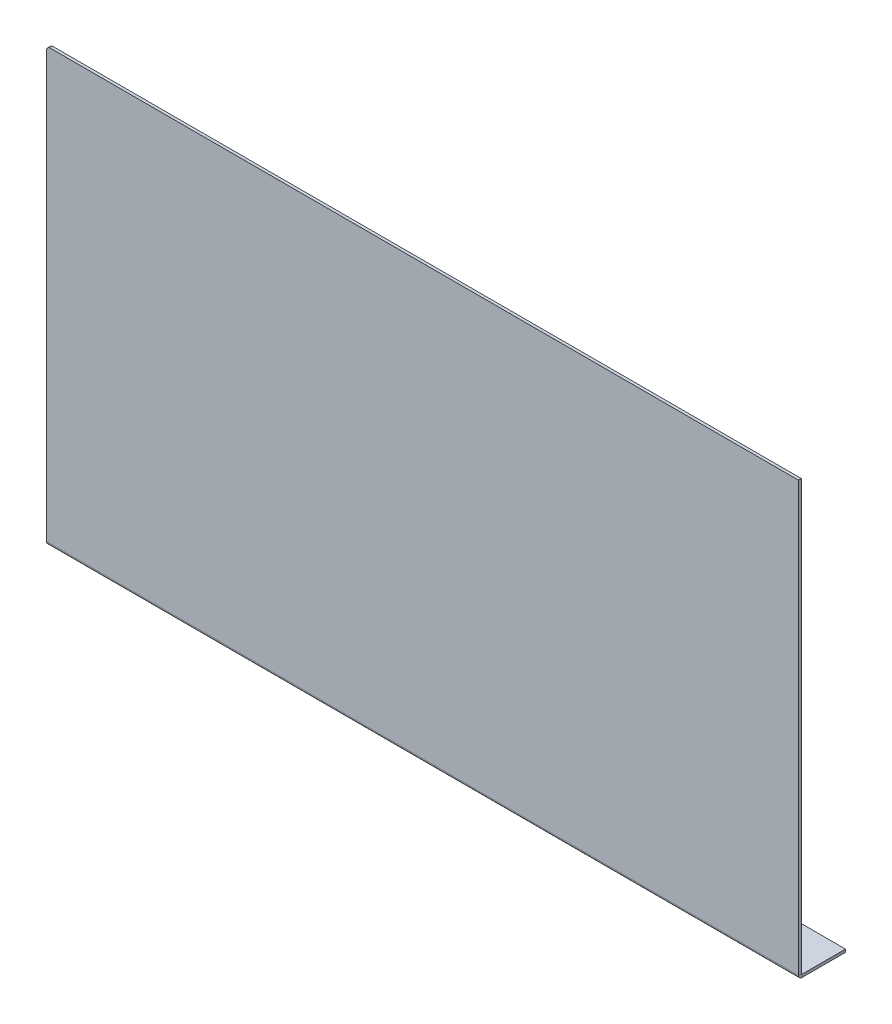
ISO-10303-21;
HEADER;
FILE_DESCRIPTION(('STEP AP214'),'2;1');
FILE_NAME('part.step','',(''),(''),'','','');
FILE_SCHEMA(('AUTOMOTIVE_DESIGN { 1 0 10303 214 1 1 1 1 }'));
ENDSEC;
DATA;
#1=APPLICATION_CONTEXT('core data for automotive mechanical design processes');
#2=APPLICATION_PROTOCOL_DEFINITION('international standard','automotive_design',2000,#1);
#3=PRODUCT_CONTEXT('',#1,'mechanical');
#4=PRODUCT('Part','Part','',(#3));
#5=PRODUCT_RELATED_PRODUCT_CATEGORY('part','',(#4));
#6=PRODUCT_DEFINITION_FORMATION('','',#4);
#7=PRODUCT_DEFINITION_CONTEXT('part definition',#1,'design');
#8=PRODUCT_DEFINITION('design','',#6,#7);
#9=PRODUCT_DEFINITION_SHAPE('','',#8);
#10=(LENGTH_UNIT() NAMED_UNIT(*) SI_UNIT(.MILLI.,.METRE.));
#11=(NAMED_UNIT(*) PLANE_ANGLE_UNIT() SI_UNIT($,.RADIAN.));
#12=(NAMED_UNIT(*) SI_UNIT($,.STERADIAN.) SOLID_ANGLE_UNIT());
#13=UNCERTAINTY_MEASURE_WITH_UNIT(LENGTH_MEASURE(1.E-05),#10,'distance_accuracy_value','');
#14=(GEOMETRIC_REPRESENTATION_CONTEXT(3) GLOBAL_UNCERTAINTY_ASSIGNED_CONTEXT((#13)) GLOBAL_UNIT_ASSIGNED_CONTEXT((#10,
#11,#12)) REPRESENTATION_CONTEXT('',''));
#15=CARTESIAN_POINT('',(0.,0.,0.));
#16=DIRECTION('',(0.,0.,1.));
#17=DIRECTION('',(1.,0.,0.));
#18=AXIS2_PLACEMENT_3D('',#15,#16,#17);
#19=CARTESIAN_POINT('',(176.5,-124.5,-25.));
#20=DIRECTION('',(-1.,0.,0.));
#21=DIRECTION('',(0.,0.,1.));
#22=AXIS2_PLACEMENT_3D('',#19,#20,#21);
#23=PLANE('',#22);
#24=DIRECTION('',(0.,0.,-1.));
#25=VECTOR('',#24,1.);
#26=CARTESIAN_POINT('',(176.5,-122.171572875254,-23.5));
#27=LINE('',#26,#25);
#28=CARTESIAN_POINT('',(176.5,-122.171572875254,-23.5));
#29=VERTEX_POINT('',#28);
#30=CARTESIAN_POINT('',(176.5,-122.171572875254,-25.));
#31=VERTEX_POINT('',#30);
#32=EDGE_CURVE('E316',#29,#31,#27,.T.);
#33=ORIENTED_EDGE('',*,*,#32,.T.);
#34=DIRECTION('',(0.,-1.,0.));
#35=VECTOR('',#34,1.);
#36=CARTESIAN_POINT('',(176.5,0.,-25.));
#37=LINE('',#36,#35);
#38=CARTESIAN_POINT('',(176.5,-115.5,-25.));
#39=VERTEX_POINT('',#38);
#40=EDGE_CURVE('E334',#39,#31,#37,.T.);
#41=ORIENTED_EDGE('',*,*,#40,.F.);
#42=DIRECTION('',(0.,0.,1.));
#43=VECTOR('',#42,1.);
#44=CARTESIAN_POINT('',(176.5,-115.5,-23.5));
#45=LINE('',#44,#43);
#46=CARTESIAN_POINT('',(176.5,-115.5,-23.5));
#47=VERTEX_POINT('',#46);
#48=EDGE_CURVE('E343',#47,#39,#45,.F.);
#49=ORIENTED_EDGE('',*,*,#48,.F.);
#50=DIRECTION('',(0.,1.,0.));
#51=VECTOR('',#50,1.);
#52=CARTESIAN_POINT('',(176.5,-124.5,-23.5));
#53=LINE('',#52,#51);
#54=EDGE_CURVE('E338',#47,#29,#53,.F.);
#55=ORIENTED_EDGE('',*,*,#54,.T.);
#56=EDGE_LOOP('',(#33,#41,#49,#55));
#57=FACE_BOUND('',#56,.T.);
#58=ADVANCED_FACE('F98',(#57),#23,.F.);
#59=CARTESIAN_POINT('',(-176.5,-115.,-25.));
#60=DIRECTION('',(1.,0.,0.));
#61=DIRECTION('',(0.,1.,0.));
#62=AXIS2_PLACEMENT_3D('',#59,#60,#61);
#63=PLANE('',#62);
#64=DIRECTION('',(0.,0.,-1.));
#65=VECTOR('',#64,1.);
#66=CARTESIAN_POINT('',(-176.5,-122.171572875254,-23.5));
#67=LINE('',#66,#65);
#68=CARTESIAN_POINT('',(-176.5,-122.171572875254,-23.5));
#69=VERTEX_POINT('',#68);
#70=CARTESIAN_POINT('',(-176.5,-122.171572875254,-25.));
#71=VERTEX_POINT('',#70);
#72=EDGE_CURVE('E325',#69,#71,#67,.T.);
#73=ORIENTED_EDGE('',*,*,#72,.F.);
#74=DIRECTION('',(0.,-1.,0.));
#75=VECTOR('',#74,1.);
#76=CARTESIAN_POINT('',(-176.5,-115.,-23.5));
#77=LINE('',#76,#75);
#78=CARTESIAN_POINT('',(-176.5,-115.5,-23.5));
#79=VERTEX_POINT('',#78);
#80=EDGE_CURVE('E336',#69,#79,#77,.F.);
#81=ORIENTED_EDGE('',*,*,#80,.T.);
#82=DIRECTION('',(0.,0.,1.));
#83=VECTOR('',#82,1.);
#84=CARTESIAN_POINT('',(-176.5,-115.5,-25.));
#85=LINE('',#84,#83);
#86=CARTESIAN_POINT('',(-176.5,-115.5,-25.));
#87=VERTEX_POINT('',#86);
#88=EDGE_CURVE('E328',#79,#87,#85,.F.);
#89=ORIENTED_EDGE('',*,*,#88,.T.);
#90=DIRECTION('',(0.,1.,0.));
#91=VECTOR('',#90,1.);
#92=CARTESIAN_POINT('',(-176.5,5.2090660055126E-13,-25.));
#93=LINE('',#92,#91);
#94=EDGE_CURVE('E331',#71,#87,#93,.T.);
#95=ORIENTED_EDGE('',*,*,#94,.F.);
#96=EDGE_LOOP('',(#73,#81,#89,#95));
#97=FACE_BOUND('',#96,.T.);
#98=ADVANCED_FACE('F560',(#97),#63,.F.);
#99=CARTESIAN_POINT('',(0.,0.,-25.));
#100=DIRECTION('',(0.,0.,1.));
#101=DIRECTION('',(1.,0.,0.));
#102=AXIS2_PLACEMENT_3D('',#99,#100,#101);
#103=PLANE('',#102);
#104=DIRECTION('',(1.,0.,0.));
#105=VECTOR('',#104,1.);
#106=CARTESIAN_POINT('',(176.5,-122.171572875254,-25.));
#107=LINE('',#106,#105);
#108=EDGE_CURVE('E310',#31,#71,#107,.F.);
#109=ORIENTED_EDGE('',*,*,#108,.T.);
#110=ORIENTED_EDGE('',*,*,#94,.T.);
#111=DIRECTION('',(1.,0.,0.));
#112=VECTOR('',#111,1.);
#113=CARTESIAN_POINT('',(-176.5,-115.5,-25.));
#114=LINE('',#113,#112);
#115=EDGE_CURVE('E340',#39,#87,#114,.F.);
#116=ORIENTED_EDGE('',*,*,#115,.F.);
#117=ORIENTED_EDGE('',*,*,#40,.T.);
#118=EDGE_LOOP('',(#109,#110,#116,#117));
#119=FACE_BOUND('',#118,.T.);
#120=ADVANCED_FACE('F566',(#119),#103,.F.);
#121=CARTESIAN_POINT('',(0.,0.,-23.5));
#122=DIRECTION('',(0.,0.,1.));
#123=DIRECTION('',(1.,0.,0.));
#124=AXIS2_PLACEMENT_3D('',#121,#122,#123);
#125=PLANE('',#124);
#126=ORIENTED_EDGE('',*,*,#80,.F.);
#127=DIRECTION('',(1.,0.,0.));
#128=VECTOR('',#127,1.);
#129=CARTESIAN_POINT('',(176.5,-122.171572875254,-23.5));
#130=LINE('',#129,#128);
#131=EDGE_CURVE('E113',#29,#69,#130,.F.);
#132=ORIENTED_EDGE('',*,*,#131,.F.);
#133=ORIENTED_EDGE('',*,*,#54,.F.);
#134=DIRECTION('',(1.,0.,0.));
#135=VECTOR('',#134,1.);
#136=CARTESIAN_POINT('',(-176.5,-115.5,-23.5));
#137=LINE('',#136,#135);
#138=EDGE_CURVE('E346',#79,#47,#137,.T.);
#139=ORIENTED_EDGE('',*,*,#138,.F.);
#140=EDGE_LOOP('',(#126,#132,#133,#139));
#141=FACE_BOUND('',#140,.T.);
#142=ADVANCED_FACE('F613',(#141),#125,.T.);
#143=CARTESIAN_POINT('',(0.,-115.,4.12712693812177E-13));
#144=DIRECTION('',(0.,-1.,0.));
#145=DIRECTION('',(0.,0.,-1.));
#146=AXIS2_PLACEMENT_3D('',#143,#144,#145);
#147=PLANE('',#146);
#148=DIRECTION('',(-1.,0.,0.));
#149=VECTOR('',#148,1.);
#150=CARTESIAN_POINT('',(177.25,-115.,-22.25));
#151=LINE('',#150,#149);
#152=CARTESIAN_POINT('',(177.25,-115.,-22.25));
#153=VERTEX_POINT('',#152);
#154=CARTESIAN_POINT('',(176.5,-115.,-22.25));
#155=VERTEX_POINT('',#154);
#156=EDGE_CURVE('E379',#153,#155,#151,.T.);
#157=ORIENTED_EDGE('',*,*,#156,.F.);
#158=DIRECTION('',(0.,0.,1.));
#159=VECTOR('',#158,1.);
#160=CARTESIAN_POINT('',(177.25,-115.,-25.));
#161=LINE('',#160,#159);
#162=CARTESIAN_POINT('',(177.25,-115.,-25.));
#163=VERTEX_POINT('',#162);
#164=EDGE_CURVE('E374',#163,#153,#161,.T.);
#165=ORIENTED_EDGE('',*,*,#164,.F.);
#166=DIRECTION('',(-1.,0.,0.));
#167=VECTOR('',#166,1.);
#168=CARTESIAN_POINT('',(-200.,-115.,-25.));
#169=LINE('',#168,#167);
#170=CARTESIAN_POINT('',(200.,-115.,-25.));
#171=VERTEX_POINT('',#170);
#172=EDGE_CURVE('E421',#171,#163,#169,.T.);
#173=ORIENTED_EDGE('',*,*,#172,.F.);
#174=DIRECTION('',(0.,0.,-1.));
#175=VECTOR('',#174,1.);
#176=CARTESIAN_POINT('',(200.,-115.,-25.));
#177=LINE('',#176,#175);
#178=CARTESIAN_POINT('',(200.,-115.,-1.79999999999994));
#179=VERTEX_POINT('',#178);
#180=EDGE_CURVE('E425',#179,#171,#177,.T.);
#181=ORIENTED_EDGE('',*,*,#180,.F.);
#182=DIRECTION('',(-1.,0.,0.));
#183=VECTOR('',#182,1.);
#184=CARTESIAN_POINT('',(0.,-115.,-1.79999999999994));
#185=LINE('',#184,#183);
#186=CARTESIAN_POINT('',(-200.,-115.,-1.79999999999989));
#187=VERTEX_POINT('',#186);
#188=EDGE_CURVE('E436',#179,#187,#185,.T.);
#189=ORIENTED_EDGE('',*,*,#188,.T.);
#190=DIRECTION('',(0.,0.,1.));
#191=VECTOR('',#190,1.);
#192=CARTESIAN_POINT('',(-200.,-115.,-1.49999999999992));
#193=LINE('',#192,#191);
#194=CARTESIAN_POINT('',(-200.,-115.,-25.));
#195=VERTEX_POINT('',#194);
#196=EDGE_CURVE('E418',#195,#187,#193,.T.);
#197=ORIENTED_EDGE('',*,*,#196,.F.);
#198=CARTESIAN_POINT('',(-177.25,-115.,-25.));
#199=VERTEX_POINT('',#198);
#200=EDGE_CURVE('E424',#199,#195,#169,.T.);
#201=ORIENTED_EDGE('',*,*,#200,.F.);
#202=DIRECTION('',(0.,0.,-1.));
#203=VECTOR('',#202,1.);
#204=CARTESIAN_POINT('',(-177.25,-115.,-22.25));
#205=LINE('',#204,#203);
#206=CARTESIAN_POINT('',(-177.25,-115.,-22.25));
#207=VERTEX_POINT('',#206);
#208=EDGE_CURVE('E393',#207,#199,#205,.T.);
#209=ORIENTED_EDGE('',*,*,#208,.F.);
#210=DIRECTION('',(-1.,0.,0.));
#211=VECTOR('',#210,1.);
#212=CARTESIAN_POINT('',(-176.5,-115.,-22.25));
#213=LINE('',#212,#211);
#214=CARTESIAN_POINT('',(-176.5,-115.,-22.25));
#215=VERTEX_POINT('',#214);
#216=EDGE_CURVE('E389',#215,#207,#213,.T.);
#217=ORIENTED_EDGE('',*,*,#216,.F.);
#218=DIRECTION('',(0.,0.,1.));
#219=VECTOR('',#218,1.);
#220=CARTESIAN_POINT('',(-176.5,-115.,-23.));
#221=LINE('',#220,#219);
#222=CARTESIAN_POINT('',(-176.5,-115.,-23.));
#223=VERTEX_POINT('',#222);
#224=EDGE_CURVE('E386',#223,#215,#221,.T.);
#225=ORIENTED_EDGE('',*,*,#224,.F.);
#226=DIRECTION('',(1.,0.,0.));
#227=VECTOR('',#226,1.);
#228=CARTESIAN_POINT('',(176.5,-115.,-23.));
#229=LINE('',#228,#227);
#230=CARTESIAN_POINT('',(176.5,-115.,-23.));
#231=VERTEX_POINT('',#230);
#232=EDGE_CURVE('E363',#231,#223,#229,.F.);
#233=ORIENTED_EDGE('',*,*,#232,.F.);
#234=DIRECTION('',(0.,0.,-1.));
#235=VECTOR('',#234,1.);
#236=CARTESIAN_POINT('',(176.5,-115.,-22.25));
#237=LINE('',#236,#235);
#238=EDGE_CURVE('E383',#155,#231,#237,.T.);
#239=ORIENTED_EDGE('',*,*,#238,.F.);
#240=EDGE_LOOP('',(#157,#165,#173,#181,#189,#197,#201,#209,#217,#225,#233,#239));
#241=FACE_BOUND('',#240,.T.);
#242=ADVANCED_FACE('F533',(#241),#147,.T.);
#243=CARTESIAN_POINT('',(0.,-113.5,4.07475471803913E-13));
#244=DIRECTION('',(0.,-1.,0.));
#245=DIRECTION('',(0.,0.,-1.));
#246=AXIS2_PLACEMENT_3D('',#243,#244,#245);
#247=PLANE('',#246);
#248=DIRECTION('',(0.,0.,-1.));
#249=VECTOR('',#248,1.);
#250=CARTESIAN_POINT('',(177.25,-113.5,-1.38149753833072E-12));
#251=LINE('',#250,#249);
#252=CARTESIAN_POINT('',(177.25,-113.5,-22.25));
#253=VERTEX_POINT('',#252);
#254=CARTESIAN_POINT('',(177.25,-113.5,-25.));
#255=VERTEX_POINT('',#254);
#256=EDGE_CURVE('E408',#253,#255,#251,.T.);
#257=ORIENTED_EDGE('',*,*,#256,.F.);
#258=DIRECTION('',(1.,0.,0.));
#259=VECTOR('',#258,1.);
#260=CARTESIAN_POINT('',(0.,-113.5,-22.25));
#261=LINE('',#260,#259);
#262=CARTESIAN_POINT('',(176.5,-113.5,-22.25));
#263=VERTEX_POINT('',#262);
#264=EDGE_CURVE('E491',#263,#253,#261,.T.);
#265=ORIENTED_EDGE('',*,*,#264,.F.);
#266=DIRECTION('',(0.,0.,1.));
#267=VECTOR('',#266,1.);
#268=CARTESIAN_POINT('',(176.5,-113.5,4.07475471803913E-13));
#269=LINE('',#268,#267);
#270=CARTESIAN_POINT('',(176.5,-113.5,-23.));
#271=VERTEX_POINT('',#270);
#272=EDGE_CURVE('E489',#271,#263,#269,.T.);
#273=ORIENTED_EDGE('',*,*,#272,.F.);
#274=DIRECTION('',(1.,0.,0.));
#275=VECTOR('',#274,1.);
#276=CARTESIAN_POINT('',(176.5,-113.5,-23.));
#277=LINE('',#276,#275);
#278=CARTESIAN_POINT('',(-176.5,-113.5,-23.));
#279=VERTEX_POINT('',#278);
#280=EDGE_CURVE('E350',#271,#279,#277,.F.);
#281=ORIENTED_EDGE('',*,*,#280,.T.);
#282=DIRECTION('',(0.,0.,-1.));
#283=VECTOR('',#282,1.);
#284=CARTESIAN_POINT('',(-176.5,-113.5,4.07475471803913E-13));
#285=LINE('',#284,#283);
#286=CARTESIAN_POINT('',(-176.5,-113.5,-22.25));
#287=VERTEX_POINT('',#286);
#288=EDGE_CURVE('E487',#287,#279,#285,.T.);
#289=ORIENTED_EDGE('',*,*,#288,.F.);
#290=DIRECTION('',(1.,0.,0.));
#291=VECTOR('',#290,1.);
#292=CARTESIAN_POINT('',(0.,-113.5,-22.25));
#293=LINE('',#292,#291);
#294=CARTESIAN_POINT('',(-177.25,-113.5,-22.25));
#295=VERTEX_POINT('',#294);
#296=EDGE_CURVE('E485',#295,#287,#293,.T.);
#297=ORIENTED_EDGE('',*,*,#296,.F.);
#298=DIRECTION('',(0.,0.,1.));
#299=VECTOR('',#298,1.);
#300=CARTESIAN_POINT('',(-177.25,-113.5,4.07475471803913E-13));
#301=LINE('',#300,#299);
#302=CARTESIAN_POINT('',(-177.25,-113.5,-25.));
#303=VERTEX_POINT('',#302);
#304=EDGE_CURVE('E377',#303,#295,#301,.T.);
#305=ORIENTED_EDGE('',*,*,#304,.F.);
#306=DIRECTION('',(1.,0.,0.));
#307=VECTOR('',#306,1.);
#308=CARTESIAN_POINT('',(0.,-113.5,-25.));
#309=LINE('',#308,#307);
#310=CARTESIAN_POINT('',(-200.,-113.5,-25.));
#311=VERTEX_POINT('',#310);
#312=EDGE_CURVE('E433',#303,#311,#309,.F.);
#313=ORIENTED_EDGE('',*,*,#312,.T.);
#314=DIRECTION('',(0.,0.,-1.));
#315=VECTOR('',#314,1.);
#316=CARTESIAN_POINT('',(-200.,-113.5,4.07475471803913E-13));
#317=LINE('',#316,#315);
#318=CARTESIAN_POINT('',(-200.,-113.5,-1.79999999999995));
#319=VERTEX_POINT('',#318);
#320=EDGE_CURVE('E427',#311,#319,#317,.F.);
#321=ORIENTED_EDGE('',*,*,#320,.T.);
#322=DIRECTION('',(1.,0.,0.));
#323=VECTOR('',#322,1.);
#324=CARTESIAN_POINT('',(200.,-113.5,-1.8));
#325=LINE('',#324,#323);
#326=CARTESIAN_POINT('',(200.,-113.5,-1.79999999999995));
#327=VERTEX_POINT('',#326);
#328=EDGE_CURVE('E442',#327,#319,#325,.F.);
#329=ORIENTED_EDGE('',*,*,#328,.F.);
#330=DIRECTION('',(0.,0.,1.));
#331=VECTOR('',#330,1.);
#332=CARTESIAN_POINT('',(200.,-113.5,6.43693136617775E-13));
#333=LINE('',#332,#331);
#334=CARTESIAN_POINT('',(200.,-113.5,-25.));
#335=VERTEX_POINT('',#334);
#336=EDGE_CURVE('E434',#327,#335,#333,.F.);
#337=ORIENTED_EDGE('',*,*,#336,.T.);
#338=EDGE_CURVE('E430',#335,#255,#309,.F.);
#339=ORIENTED_EDGE('',*,*,#338,.T.);
#340=EDGE_LOOP('',(#257,#265,#273,#281,#289,#297,#305,#313,#321,#329,#337,#339));
#341=FACE_BOUND('',#340,.T.);
#342=ADVANCED_FACE('F541',(#341),#247,.F.);
#343=CARTESIAN_POINT('',(-200.,-115.,-25.));
#344=DIRECTION('',(0.,0.,-1.));
#345=DIRECTION('',(0.,1.,0.));
#346=AXIS2_PLACEMENT_3D('',#343,#344,#345);
#347=PLANE('',#346);
#348=ORIENTED_EDGE('',*,*,#172,.T.);
#349=DIRECTION('',(0.,1.,0.));
#350=VECTOR('',#349,1.);
#351=CARTESIAN_POINT('',(177.25,-115.,-25.));
#352=LINE('',#351,#350);
#353=EDGE_CURVE('E378',#163,#255,#352,.T.);
#354=ORIENTED_EDGE('',*,*,#353,.T.);
#355=ORIENTED_EDGE('',*,*,#338,.F.);
#356=DIRECTION('',(0.,1.,0.));
#357=VECTOR('',#356,1.);
#358=CARTESIAN_POINT('',(200.,-115.,-25.));
#359=LINE('',#358,#357);
#360=EDGE_CURVE('E415',#171,#335,#359,.T.);
#361=ORIENTED_EDGE('',*,*,#360,.F.);
#362=EDGE_LOOP('',(#348,#354,#355,#361));
#363=FACE_BOUND('',#362,.T.);
#364=ADVANCED_FACE('F537',(#363),#347,.T.);
#365=ORIENTED_EDGE('',*,*,#312,.F.);
#366=DIRECTION('',(0.,1.,0.));
#367=VECTOR('',#366,1.);
#368=CARTESIAN_POINT('',(-177.25,-115.,-25.));
#369=LINE('',#368,#367);
#370=EDGE_CURVE('E395',#199,#303,#369,.T.);
#371=ORIENTED_EDGE('',*,*,#370,.F.);
#372=ORIENTED_EDGE('',*,*,#200,.T.);
#373=DIRECTION('',(0.,1.,0.));
#374=VECTOR('',#373,1.);
#375=CARTESIAN_POINT('',(-200.,-115.,-25.));
#376=LINE('',#375,#374);
#377=EDGE_CURVE('E411',#195,#311,#376,.T.);
#378=ORIENTED_EDGE('',*,*,#377,.T.);
#379=EDGE_LOOP('',(#365,#371,#372,#378));
#380=FACE_BOUND('',#379,.T.);
#381=ADVANCED_FACE('F620',(#380),#347,.T.);
#382=CARTESIAN_POINT('',(-200.,115.,-1.5));
#383=DIRECTION('',(-1.,0.,0.));
#384=DIRECTION('',(0.,-1.,0.));
#385=AXIS2_PLACEMENT_3D('',#382,#383,#384);
#386=PLANE('',#385);
#387=DIRECTION('',(0.,-1.,0.));
#388=VECTOR('',#387,1.);
#389=CARTESIAN_POINT('',(-200.,115.,0.));
#390=LINE('',#389,#388);
#391=CARTESIAN_POINT('',(-200.,113.,0.));
#392=VERTEX_POINT('',#391);
#393=CARTESIAN_POINT('',(-200.,-113.2,0.));
#394=VERTEX_POINT('',#393);
#395=EDGE_CURVE('E472',#392,#394,#390,.T.);
#396=ORIENTED_EDGE('',*,*,#395,.F.);
#397=DIRECTION('',(0.,0.,1.));
#398=VECTOR('',#397,1.);
#399=CARTESIAN_POINT('',(-200.,113.,-1.5));
#400=LINE('',#399,#398);
#401=CARTESIAN_POINT('',(-200.,113.,-1.5));
#402=VERTEX_POINT('',#401);
#403=EDGE_CURVE('E106',#392,#402,#400,.F.);
#404=ORIENTED_EDGE('',*,*,#403,.T.);
#405=DIRECTION('',(0.,-1.,0.));
#406=VECTOR('',#405,1.);
#407=CARTESIAN_POINT('',(-200.,115.,-1.5));
#408=LINE('',#407,#406);
#409=CARTESIAN_POINT('',(-200.,-113.2,-1.49999999999995));
#410=VERTEX_POINT('',#409);
#411=EDGE_CURVE('E475',#402,#410,#408,.T.);
#412=ORIENTED_EDGE('',*,*,#411,.T.);
#413=DIRECTION('',(0.,0.,1.));
#414=VECTOR('',#413,1.);
#415=CARTESIAN_POINT('',(-200.,-113.2,-1.49999999999995));
#416=LINE('',#415,#414);
#417=EDGE_CURVE('E453',#410,#394,#416,.T.);
#418=ORIENTED_EDGE('',*,*,#417,.T.);
#419=EDGE_LOOP('',(#396,#404,#412,#418));
#420=FACE_BOUND('',#419,.T.);
#421=ADVANCED_FACE('F503',(#420),#386,.T.);
#422=CARTESIAN_POINT('',(0.,0.,-1.5));
#423=DIRECTION('',(0.,0.,1.));
#424=DIRECTION('',(1.,0.,0.));
#425=AXIS2_PLACEMENT_3D('',#422,#423,#424);
#426=PLANE('',#425);
#427=ORIENTED_EDGE('',*,*,#411,.F.);
#428=CARTESIAN_POINT('',(-198.,113.,-1.5));
#429=DIRECTION('',(0.,0.,1.));
#430=DIRECTION('',(1.,0.,0.));
#431=AXIS2_PLACEMENT_3D('',#428,#429,#430);
#432=CIRCLE('',#431,2.);
#433=CARTESIAN_POINT('',(-198.,115.,-1.5));
#434=VERTEX_POINT('',#433);
#435=EDGE_CURVE('E13',#402,#434,#432,.F.);
#436=ORIENTED_EDGE('',*,*,#435,.T.);
#437=DIRECTION('',(-1.,0.,0.));
#438=VECTOR('',#437,1.);
#439=CARTESIAN_POINT('',(-200.,115.,-1.5));
#440=LINE('',#439,#438);
#441=CARTESIAN_POINT('',(200.,115.,-1.5));
#442=VERTEX_POINT('',#441);
#443=EDGE_CURVE('E471',#442,#434,#440,.T.);
#444=ORIENTED_EDGE('',*,*,#443,.F.);
#445=DIRECTION('',(0.,1.,0.));
#446=VECTOR('',#445,1.);
#447=CARTESIAN_POINT('',(200.,115.,-1.5));
#448=LINE('',#447,#446);
#449=CARTESIAN_POINT('',(200.,-113.2,-1.49999999999995));
#450=VERTEX_POINT('',#449);
#451=EDGE_CURVE('E469',#450,#442,#448,.T.);
#452=ORIENTED_EDGE('',*,*,#451,.F.);
#453=DIRECTION('',(-1.,0.,0.));
#454=VECTOR('',#453,1.);
#455=CARTESIAN_POINT('',(-200.,-113.2,-1.49999999999995));
#456=LINE('',#455,#454);
#457=EDGE_CURVE('E459',#410,#450,#456,.F.);
#458=ORIENTED_EDGE('',*,*,#457,.F.);
#459=EDGE_LOOP('',(#427,#436,#444,#452,#458));
#460=FACE_BOUND('',#459,.T.);
#461=ADVANCED_FACE('F508',(#460),#426,.F.);
#462=CARTESIAN_POINT('',(0.,0.,0.));
#463=DIRECTION('',(0.,0.,1.));
#464=DIRECTION('',(1.,0.,0.));
#465=AXIS2_PLACEMENT_3D('',#462,#463,#464);
#466=PLANE('',#465);
#467=DIRECTION('',(-1.,0.,0.));
#468=VECTOR('',#467,1.);
#469=CARTESIAN_POINT('',(-200.,115.,0.));
#470=LINE('',#469,#468);
#471=CARTESIAN_POINT('',(200.,115.,0.));
#472=VERTEX_POINT('',#471);
#473=CARTESIAN_POINT('',(-198.,115.,0.));
#474=VERTEX_POINT('',#473);
#475=EDGE_CURVE('E479',#472,#474,#470,.T.);
#476=ORIENTED_EDGE('',*,*,#475,.T.);
#477=CARTESIAN_POINT('',(-198.,113.,0.));
#478=DIRECTION('',(0.,0.,1.));
#479=DIRECTION('',(1.,0.,0.));
#480=AXIS2_PLACEMENT_3D('',#477,#478,#479);
#481=CIRCLE('',#480,2.);
#482=EDGE_CURVE('E496',#474,#392,#481,.T.);
#483=ORIENTED_EDGE('',*,*,#482,.T.);
#484=ORIENTED_EDGE('',*,*,#395,.T.);
#485=DIRECTION('',(-1.,0.,0.));
#486=VECTOR('',#485,1.);
#487=CARTESIAN_POINT('',(-200.,-113.2,0.));
#488=LINE('',#487,#486);
#489=CARTESIAN_POINT('',(200.,-113.2,0.));
#490=VERTEX_POINT('',#489);
#491=EDGE_CURVE('E446',#394,#490,#488,.F.);
#492=ORIENTED_EDGE('',*,*,#491,.T.);
#493=DIRECTION('',(0.,1.,0.));
#494=VECTOR('',#493,1.);
#495=CARTESIAN_POINT('',(200.,115.,0.));
#496=LINE('',#495,#494);
#497=EDGE_CURVE('E466',#490,#472,#496,.T.);
#498=ORIENTED_EDGE('',*,*,#497,.T.);
#499=EDGE_LOOP('',(#476,#483,#484,#492,#498));
#500=FACE_BOUND('',#499,.T.);
#501=ADVANCED_FACE('F498',(#500),#466,.T.);
#502=CARTESIAN_POINT('',(200.,115.,-1.5));
#503=DIRECTION('',(1.,0.,0.));
#504=DIRECTION('',(0.,1.,0.));
#505=AXIS2_PLACEMENT_3D('',#502,#503,#504);
#506=PLANE('',#505);
#507=DIRECTION('',(0.,0.,1.));
#508=VECTOR('',#507,1.);
#509=CARTESIAN_POINT('',(200.,-113.2,-1.49999999999995));
#510=LINE('',#509,#508);
#511=EDGE_CURVE('E463',#450,#490,#510,.T.);
#512=ORIENTED_EDGE('',*,*,#511,.F.);
#513=ORIENTED_EDGE('',*,*,#451,.T.);
#514=DIRECTION('',(0.,0.,1.));
#515=VECTOR('',#514,1.);
#516=CARTESIAN_POINT('',(200.,115.,-1.5));
#517=LINE('',#516,#515);
#518=EDGE_CURVE('E477',#442,#472,#517,.T.);
#519=ORIENTED_EDGE('',*,*,#518,.T.);
#520=ORIENTED_EDGE('',*,*,#497,.F.);
#521=EDGE_LOOP('',(#512,#513,#519,#520));
#522=FACE_BOUND('',#521,.T.);
#523=ADVANCED_FACE('F517',(#522),#506,.T.);
#524=CARTESIAN_POINT('',(-200.,115.,-1.5));
#525=DIRECTION('',(0.,1.,0.));
#526=DIRECTION('',(0.,0.,1.));
#527=AXIS2_PLACEMENT_3D('',#524,#525,#526);
#528=PLANE('',#527);
#529=ORIENTED_EDGE('',*,*,#443,.T.);
#530=DIRECTION('',(0.,0.,1.));
#531=VECTOR('',#530,1.);
#532=CARTESIAN_POINT('',(-198.,115.,-1.5));
#533=LINE('',#532,#531);
#534=EDGE_CURVE('E493',#434,#474,#533,.T.);
#535=ORIENTED_EDGE('',*,*,#534,.T.);
#536=ORIENTED_EDGE('',*,*,#475,.F.);
#537=ORIENTED_EDGE('',*,*,#518,.F.);
#538=EDGE_LOOP('',(#529,#535,#536,#537));
#539=FACE_BOUND('',#538,.T.);
#540=ADVANCED_FACE('F513',(#539),#528,.T.);
#541=CARTESIAN_POINT('',(200.,-113.2,-1.79999999999995));
#542=DIRECTION('',(1.,0.,0.));
#543=DIRECTION('',(0.,0.,-1.));
#544=AXIS2_PLACEMENT_3D('',#541,#542,#543);
#545=PLANE('',#544);
#546=DIRECTION('',(0.,-1.,0.));
#547=VECTOR('',#546,1.);
#548=CARTESIAN_POINT('',(200.,-115.,-1.79999999999999));
#549=LINE('',#548,#547);
#550=EDGE_CURVE('E410',#327,#179,#549,.T.);
#551=ORIENTED_EDGE('',*,*,#550,.F.);
#552=CARTESIAN_POINT('',(200.,-113.2,-1.79999999999995));
#553=DIRECTION('',(-1.,0.,0.));
#554=DIRECTION('',(0.,0.,1.));
#555=AXIS2_PLACEMENT_3D('',#552,#553,#554);
#556=CIRCLE('',#555,0.299999999999995);
#557=EDGE_CURVE('E456',#450,#327,#556,.F.);
#558=ORIENTED_EDGE('',*,*,#557,.F.);
#559=ORIENTED_EDGE('',*,*,#511,.T.);
#560=CARTESIAN_POINT('',(200.,-113.2,-1.79999999999995));
#561=DIRECTION('',(-1.,0.,0.));
#562=DIRECTION('',(0.,0.,1.));
#563=AXIS2_PLACEMENT_3D('',#560,#561,#562);
#564=CIRCLE('',#563,1.79999999999999);
#565=EDGE_CURVE('E449',#490,#179,#564,.F.);
#566=ORIENTED_EDGE('',*,*,#565,.T.);
#567=EDGE_LOOP('',(#551,#558,#559,#566));
#568=FACE_BOUND('',#567,.T.);
#569=ADVANCED_FACE('F524',(#568),#545,.T.);
#570=CARTESIAN_POINT('',(-200.,-113.2,-1.79999999999995));
#571=DIRECTION('',(1.,0.,0.));
#572=DIRECTION('',(0.,0.,-1.));
#573=AXIS2_PLACEMENT_3D('',#570,#571,#572);
#574=PLANE('',#573);
#575=CARTESIAN_POINT('',(-200.,-113.2,-1.79999999999995));
#576=DIRECTION('',(-1.,0.,0.));
#577=DIRECTION('',(0.,0.,1.));
#578=AXIS2_PLACEMENT_3D('',#575,#576,#577);
#579=CIRCLE('',#578,0.299999999999995);
#580=EDGE_CURVE('E414',#319,#410,#579,.T.);
#581=ORIENTED_EDGE('',*,*,#580,.F.);
#582=DIRECTION('',(0.,-1.,0.));
#583=VECTOR('',#582,1.);
#584=CARTESIAN_POINT('',(-200.,-113.5,-1.7999999999999));
#585=LINE('',#584,#583);
#586=EDGE_CURVE('E439',#319,#187,#585,.T.);
#587=ORIENTED_EDGE('',*,*,#586,.T.);
#588=CARTESIAN_POINT('',(-200.,-113.2,-1.79999999999995));
#589=DIRECTION('',(-1.,0.,0.));
#590=DIRECTION('',(0.,0.,1.));
#591=AXIS2_PLACEMENT_3D('',#588,#589,#590);
#592=CIRCLE('',#591,1.79999999999999);
#593=EDGE_CURVE('E450',#187,#394,#592,.T.);
#594=ORIENTED_EDGE('',*,*,#593,.T.);
#595=ORIENTED_EDGE('',*,*,#417,.F.);
#596=EDGE_LOOP('',(#581,#587,#594,#595));
#597=FACE_BOUND('',#596,.T.);
#598=ADVANCED_FACE('F546',(#597),#574,.F.);
#599=CARTESIAN_POINT('',(-200.,-113.2,-1.79999999999995));
#600=DIRECTION('',(-1.,0.,0.));
#601=DIRECTION('',(0.,-1.,0.));
#602=AXIS2_PLACEMENT_3D('',#599,#600,#601);
#603=CYLINDRICAL_SURFACE('',#602,1.79999999999999);
#604=ORIENTED_EDGE('',*,*,#491,.F.);
#605=ORIENTED_EDGE('',*,*,#593,.F.);
#606=ORIENTED_EDGE('',*,*,#188,.F.);
#607=ORIENTED_EDGE('',*,*,#565,.F.);
#608=EDGE_LOOP('',(#604,#605,#606,#607));
#609=FACE_BOUND('',#608,.T.);
#610=ADVANCED_FACE('F548',(#609),#603,.T.);
#611=CARTESIAN_POINT('',(-200.,-113.2,-1.79999999999995));
#612=DIRECTION('',(-1.,0.,0.));
#613=DIRECTION('',(0.,-1.,0.));
#614=AXIS2_PLACEMENT_3D('',#611,#612,#613);
#615=CYLINDRICAL_SURFACE('',#614,0.299999999999995);
#616=ORIENTED_EDGE('',*,*,#457,.T.);
#617=ORIENTED_EDGE('',*,*,#557,.T.);
#618=ORIENTED_EDGE('',*,*,#328,.T.);
#619=ORIENTED_EDGE('',*,*,#580,.T.);
#620=EDGE_LOOP('',(#616,#617,#618,#619));
#621=FACE_BOUND('',#620,.T.);
#622=ADVANCED_FACE('F520',(#621),#615,.F.);
#623=CARTESIAN_POINT('',(-200.,-115.,-1.49999999999992));
#624=DIRECTION('',(-1.,0.,0.));
#625=DIRECTION('',(0.,-1.,0.));
#626=AXIS2_PLACEMENT_3D('',#623,#624,#625);
#627=PLANE('',#626);
#628=ORIENTED_EDGE('',*,*,#196,.T.);
#629=ORIENTED_EDGE('',*,*,#586,.F.);
#630=ORIENTED_EDGE('',*,*,#320,.F.);
#631=ORIENTED_EDGE('',*,*,#377,.F.);
#632=EDGE_LOOP('',(#628,#629,#630,#631));
#633=FACE_BOUND('',#632,.T.);
#634=ADVANCED_FACE('F555',(#633),#627,.T.);
#635=CARTESIAN_POINT('',(200.,-115.,-25.));
#636=DIRECTION('',(1.,0.,0.));
#637=DIRECTION('',(0.,0.,-1.));
#638=AXIS2_PLACEMENT_3D('',#635,#636,#637);
#639=PLANE('',#638);
#640=ORIENTED_EDGE('',*,*,#336,.F.);
#641=ORIENTED_EDGE('',*,*,#550,.T.);
#642=ORIENTED_EDGE('',*,*,#180,.T.);
#643=ORIENTED_EDGE('',*,*,#360,.T.);
#644=EDGE_LOOP('',(#640,#641,#642,#643));
#645=FACE_BOUND('',#644,.T.);
#646=ADVANCED_FACE('F528',(#645),#639,.T.);
#647=CARTESIAN_POINT('',(177.25,-115.,-22.25));
#648=DIRECTION('',(0.,0.,-1.));
#649=DIRECTION('',(0.,1.,0.));
#650=AXIS2_PLACEMENT_3D('',#647,#648,#649);
#651=PLANE('',#650);
#652=DIRECTION('',(0.,1.,0.));
#653=VECTOR('',#652,1.);
#654=CARTESIAN_POINT('',(176.5,-115.,-22.25));
#655=LINE('',#654,#653);
#656=EDGE_CURVE('E385',#155,#263,#655,.T.);
#657=ORIENTED_EDGE('',*,*,#656,.T.);
#658=ORIENTED_EDGE('',*,*,#264,.T.);
#659=DIRECTION('',(0.,1.,0.));
#660=VECTOR('',#659,1.);
#661=CARTESIAN_POINT('',(177.25,-115.,-22.25));
#662=LINE('',#661,#660);
#663=EDGE_CURVE('E382',#153,#253,#662,.T.);
#664=ORIENTED_EDGE('',*,*,#663,.F.);
#665=ORIENTED_EDGE('',*,*,#156,.T.);
#666=EDGE_LOOP('',(#657,#658,#664,#665));
#667=FACE_BOUND('',#666,.T.);
#668=ADVANCED_FACE('F603',(#667),#651,.T.);
#669=CARTESIAN_POINT('',(176.5,-115.,-22.25));
#670=DIRECTION('',(1.,0.,0.));
#671=DIRECTION('',(0.,1.,0.));
#672=AXIS2_PLACEMENT_3D('',#669,#670,#671);
#673=PLANE('',#672);
#674=DIRECTION('',(0.,1.,0.));
#675=VECTOR('',#674,1.);
#676=CARTESIAN_POINT('',(176.5,-115.,-23.));
#677=LINE('',#676,#675);
#678=EDGE_CURVE('E357',#231,#271,#677,.T.);
#679=ORIENTED_EDGE('',*,*,#678,.T.);
#680=ORIENTED_EDGE('',*,*,#272,.T.);
#681=ORIENTED_EDGE('',*,*,#656,.F.);
#682=ORIENTED_EDGE('',*,*,#238,.T.);
#683=EDGE_LOOP('',(#679,#680,#681,#682));
#684=FACE_BOUND('',#683,.T.);
#685=ADVANCED_FACE('F599',(#684),#673,.T.);
#686=CARTESIAN_POINT('',(-176.5,-115.,-23.));
#687=DIRECTION('',(-1.,0.,0.));
#688=DIRECTION('',(0.,-1.,0.));
#689=AXIS2_PLACEMENT_3D('',#686,#687,#688);
#690=PLANE('',#689);
#691=DIRECTION('',(0.,1.,0.));
#692=VECTOR('',#691,1.);
#693=CARTESIAN_POINT('',(-176.5,-115.,-22.25));
#694=LINE('',#693,#692);
#695=EDGE_CURVE('E392',#215,#287,#694,.T.);
#696=ORIENTED_EDGE('',*,*,#695,.T.);
#697=ORIENTED_EDGE('',*,*,#288,.T.);
#698=DIRECTION('',(0.,1.,0.));
#699=VECTOR('',#698,1.);
#700=CARTESIAN_POINT('',(-176.5,-115.,-23.));
#701=LINE('',#700,#699);
#702=EDGE_CURVE('E368',#223,#279,#701,.T.);
#703=ORIENTED_EDGE('',*,*,#702,.F.);
#704=ORIENTED_EDGE('',*,*,#224,.T.);
#705=EDGE_LOOP('',(#696,#697,#703,#704));
#706=FACE_BOUND('',#705,.T.);
#707=ADVANCED_FACE('F595',(#706),#690,.T.);
#708=CARTESIAN_POINT('',(-176.5,-115.,-22.25));
#709=DIRECTION('',(0.,0.,-1.));
#710=DIRECTION('',(0.,1.,0.));
#711=AXIS2_PLACEMENT_3D('',#708,#709,#710);
#712=PLANE('',#711);
#713=DIRECTION('',(0.,1.,0.));
#714=VECTOR('',#713,1.);
#715=CARTESIAN_POINT('',(-177.25,-115.,-22.25));
#716=LINE('',#715,#714);
#717=EDGE_CURVE('E371',#207,#295,#716,.T.);
#718=ORIENTED_EDGE('',*,*,#717,.T.);
#719=ORIENTED_EDGE('',*,*,#296,.T.);
#720=ORIENTED_EDGE('',*,*,#695,.F.);
#721=ORIENTED_EDGE('',*,*,#216,.T.);
#722=EDGE_LOOP('',(#718,#719,#720,#721));
#723=FACE_BOUND('',#722,.T.);
#724=ADVANCED_FACE('F592',(#723),#712,.T.);
#725=CARTESIAN_POINT('',(177.25,-115.,-25.));
#726=DIRECTION('',(-1.,0.,0.));
#727=DIRECTION('',(0.,0.,1.));
#728=AXIS2_PLACEMENT_3D('',#725,#726,#727);
#729=PLANE('',#728);
#730=ORIENTED_EDGE('',*,*,#663,.T.);
#731=ORIENTED_EDGE('',*,*,#256,.T.);
#732=ORIENTED_EDGE('',*,*,#353,.F.);
#733=ORIENTED_EDGE('',*,*,#164,.T.);
#734=EDGE_LOOP('',(#730,#731,#732,#733));
#735=FACE_BOUND('',#734,.T.);
#736=ADVANCED_FACE('F590',(#735),#729,.T.);
#737=CARTESIAN_POINT('',(-177.25,-115.,-22.25));
#738=DIRECTION('',(1.,0.,0.));
#739=DIRECTION('',(0.,1.,0.));
#740=AXIS2_PLACEMENT_3D('',#737,#738,#739);
#741=PLANE('',#740);
#742=ORIENTED_EDGE('',*,*,#370,.T.);
#743=ORIENTED_EDGE('',*,*,#304,.T.);
#744=ORIENTED_EDGE('',*,*,#717,.F.);
#745=ORIENTED_EDGE('',*,*,#208,.T.);
#746=EDGE_LOOP('',(#742,#743,#744,#745));
#747=FACE_BOUND('',#746,.T.);
#748=ADVANCED_FACE('F583',(#747),#741,.T.);
#749=CARTESIAN_POINT('',(-176.5,-115.5,-23.));
#750=DIRECTION('',(-1.,0.,0.));
#751=DIRECTION('',(0.,0.,1.));
#752=AXIS2_PLACEMENT_3D('',#749,#750,#751);
#753=PLANE('',#752);
#754=ORIENTED_EDGE('',*,*,#88,.F.);
#755=CARTESIAN_POINT('',(-176.5,-115.5,-23.));
#756=DIRECTION('',(1.,0.,0.));
#757=DIRECTION('',(0.,0.,-1.));
#758=AXIS2_PLACEMENT_3D('',#755,#756,#757);
#759=CIRCLE('',#758,0.5);
#760=EDGE_CURVE('E360',#223,#79,#759,.F.);
#761=ORIENTED_EDGE('',*,*,#760,.F.);
#762=ORIENTED_EDGE('',*,*,#702,.T.);
#763=CARTESIAN_POINT('',(-176.5,-115.5,-23.));
#764=DIRECTION('',(1.,0.,0.));
#765=DIRECTION('',(0.,0.,-1.));
#766=AXIS2_PLACEMENT_3D('',#763,#764,#765);
#767=CIRCLE('',#766,2.);
#768=EDGE_CURVE('E353',#279,#87,#767,.F.);
#769=ORIENTED_EDGE('',*,*,#768,.T.);
#770=EDGE_LOOP('',(#754,#761,#762,#769));
#771=FACE_BOUND('',#770,.T.);
#772=ADVANCED_FACE('F580',(#771),#753,.T.);
#773=CARTESIAN_POINT('',(176.5,-115.5,-23.));
#774=DIRECTION('',(-1.,0.,0.));
#775=DIRECTION('',(0.,0.,1.));
#776=AXIS2_PLACEMENT_3D('',#773,#774,#775);
#777=PLANE('',#776);
#778=CARTESIAN_POINT('',(176.5,-115.5,-23.));
#779=DIRECTION('',(1.,0.,0.));
#780=DIRECTION('',(0.,0.,-1.));
#781=AXIS2_PLACEMENT_3D('',#778,#779,#780);
#782=CIRCLE('',#781,0.5);
#783=EDGE_CURVE('E333',#47,#231,#782,.T.);
#784=ORIENTED_EDGE('',*,*,#783,.F.);
#785=ORIENTED_EDGE('',*,*,#48,.T.);
#786=CARTESIAN_POINT('',(176.5,-115.5,-23.));
#787=DIRECTION('',(1.,0.,0.));
#788=DIRECTION('',(0.,0.,-1.));
#789=AXIS2_PLACEMENT_3D('',#786,#787,#788);
#790=CIRCLE('',#789,2.);
#791=EDGE_CURVE('E354',#39,#271,#790,.T.);
#792=ORIENTED_EDGE('',*,*,#791,.T.);
#793=ORIENTED_EDGE('',*,*,#678,.F.);
#794=EDGE_LOOP('',(#784,#785,#792,#793));
#795=FACE_BOUND('',#794,.T.);
#796=ADVANCED_FACE('F575',(#795),#777,.F.);
#797=CARTESIAN_POINT('',(176.5,-115.5,-23.));
#798=DIRECTION('',(1.,0.,0.));
#799=DIRECTION('',(0.,0.,-1.));
#800=AXIS2_PLACEMENT_3D('',#797,#798,#799);
#801=CYLINDRICAL_SURFACE('',#800,2.);
#802=ORIENTED_EDGE('',*,*,#280,.F.);
#803=ORIENTED_EDGE('',*,*,#791,.F.);
#804=ORIENTED_EDGE('',*,*,#115,.T.);
#805=ORIENTED_EDGE('',*,*,#768,.F.);
#806=EDGE_LOOP('',(#802,#803,#804,#805));
#807=FACE_BOUND('',#806,.T.);
#808=ADVANCED_FACE('F571',(#807),#801,.T.);
#809=CARTESIAN_POINT('',(176.5,-115.5,-23.));
#810=DIRECTION('',(1.,0.,0.));
#811=DIRECTION('',(0.,0.,-1.));
#812=AXIS2_PLACEMENT_3D('',#809,#810,#811);
#813=CYLINDRICAL_SURFACE('',#812,0.5);
#814=ORIENTED_EDGE('',*,*,#232,.T.);
#815=ORIENTED_EDGE('',*,*,#760,.T.);
#816=ORIENTED_EDGE('',*,*,#138,.T.);
#817=ORIENTED_EDGE('',*,*,#783,.T.);
#818=EDGE_LOOP('',(#814,#815,#816,#817));
#819=FACE_BOUND('',#818,.T.);
#820=ADVANCED_FACE('F574',(#819),#813,.F.);
#821=CARTESIAN_POINT('',(-198.,113.,-1.5));
#822=DIRECTION('',(0.,0.,1.));
#823=DIRECTION('',(1.,0.,0.));
#824=AXIS2_PLACEMENT_3D('',#821,#822,#823);
#825=CYLINDRICAL_SURFACE('',#824,2.);
#826=ORIENTED_EDGE('',*,*,#435,.F.);
#827=ORIENTED_EDGE('',*,*,#403,.F.);
#828=ORIENTED_EDGE('',*,*,#482,.F.);
#829=ORIENTED_EDGE('',*,*,#534,.F.);
#830=EDGE_LOOP('',(#826,#827,#828,#829));
#831=FACE_BOUND('',#830,.T.);
#832=ADVANCED_FACE('F100',(#831),#825,.T.);
#833=CARTESIAN_POINT('',(-176.5,-122.171572875254,-23.));
#834=DIRECTION('',(-1.,0.,0.));
#835=DIRECTION('',(0.,0.,1.));
#836=AXIS2_PLACEMENT_3D('',#833,#834,#835);
#837=PLANE('',#836);
#838=DIRECTION('',(0.,0.707106781186543,0.707106781186552));
#839=VECTOR('',#838,1.);
#840=CARTESIAN_POINT('',(-176.5,-123.585786437627,-24.4142135623731));
#841=LINE('',#840,#839);
#842=CARTESIAN_POINT('',(-176.5,-122.525126265847,-23.3535533905933));
#843=VERTEX_POINT('',#842);
#844=CARTESIAN_POINT('',(-176.5,-123.585786437627,-24.4142135623731));
#845=VERTEX_POINT('',#844);
#846=EDGE_CURVE('E301',#843,#845,#841,.F.);
#847=ORIENTED_EDGE('',*,*,#846,.F.);
#848=CARTESIAN_POINT('',(-176.5,-122.171572875254,-23.));
#849=DIRECTION('',(1.,0.,0.));
#850=DIRECTION('',(0.,0.,-1.));
#851=AXIS2_PLACEMENT_3D('',#848,#849,#850);
#852=CIRCLE('',#851,0.500000000000008);
#853=EDGE_CURVE('E319',#69,#843,#852,.F.);
#854=ORIENTED_EDGE('',*,*,#853,.F.);
#855=ORIENTED_EDGE('',*,*,#72,.T.);
#856=CARTESIAN_POINT('',(-176.5,-122.171572875254,-23.));
#857=DIRECTION('',(1.,0.,0.));
#858=DIRECTION('',(0.,0.,-1.));
#859=AXIS2_PLACEMENT_3D('',#856,#857,#858);
#860=CIRCLE('',#859,2.00000000000001);
#861=EDGE_CURVE('E312',#71,#845,#860,.F.);
#862=ORIENTED_EDGE('',*,*,#861,.T.);
#863=EDGE_LOOP('',(#847,#854,#855,#862));
#864=FACE_BOUND('',#863,.T.);
#865=ADVANCED_FACE('F675',(#864),#837,.T.);
#866=CARTESIAN_POINT('',(176.5,-122.171572875254,-23.));
#867=DIRECTION('',(-1.,0.,0.));
#868=DIRECTION('',(0.,0.,1.));
#869=AXIS2_PLACEMENT_3D('',#866,#867,#868);
#870=PLANE('',#869);
#871=CARTESIAN_POINT('',(176.5,-122.171572875254,-23.));
#872=DIRECTION('',(1.,0.,0.));
#873=DIRECTION('',(0.,0.,-1.));
#874=AXIS2_PLACEMENT_3D('',#871,#872,#873);
#875=CIRCLE('',#874,0.500000000000008);
#876=CARTESIAN_POINT('',(176.5,-122.525126265847,-23.3535533905933));
#877=VERTEX_POINT('',#876);
#878=EDGE_CURVE('E302',#877,#29,#875,.T.);
#879=ORIENTED_EDGE('',*,*,#878,.F.);
#880=DIRECTION('',(0.,0.707106781186543,0.707106781186552));
#881=VECTOR('',#880,1.);
#882=CARTESIAN_POINT('',(176.5,-122.525126265847,-23.3535533905933));
#883=LINE('',#882,#881);
#884=CARTESIAN_POINT('',(176.5,-123.585786437627,-24.4142135623731));
#885=VERTEX_POINT('',#884);
#886=EDGE_CURVE('E305',#877,#885,#883,.F.);
#887=ORIENTED_EDGE('',*,*,#886,.T.);
#888=CARTESIAN_POINT('',(176.5,-122.171572875254,-23.));
#889=DIRECTION('',(1.,0.,0.));
#890=DIRECTION('',(0.,0.,-1.));
#891=AXIS2_PLACEMENT_3D('',#888,#889,#890);
#892=CIRCLE('',#891,2.00000000000001);
#893=EDGE_CURVE('E313',#885,#31,#892,.T.);
#894=ORIENTED_EDGE('',*,*,#893,.T.);
#895=ORIENTED_EDGE('',*,*,#32,.F.);
#896=EDGE_LOOP('',(#879,#887,#894,#895));
#897=FACE_BOUND('',#896,.T.);
#898=ADVANCED_FACE('F682',(#897),#870,.F.);
#899=CARTESIAN_POINT('',(176.5,-122.171572875254,-23.));
#900=DIRECTION('',(1.,0.,0.));
#901=DIRECTION('',(0.,-0.707106781186543,-0.707106781186552));
#902=AXIS2_PLACEMENT_3D('',#899,#900,#901);
#903=CYLINDRICAL_SURFACE('',#902,2.00000000000001);
#904=ORIENTED_EDGE('',*,*,#108,.F.);
#905=ORIENTED_EDGE('',*,*,#893,.F.);
#906=DIRECTION('',(1.,0.,0.));
#907=VECTOR('',#906,1.);
#908=CARTESIAN_POINT('',(-176.5,-123.585786437627,-24.4142135623731));
#909=LINE('',#908,#907);
#910=EDGE_CURVE('E278',#885,#845,#909,.F.);
#911=ORIENTED_EDGE('',*,*,#910,.T.);
#912=ORIENTED_EDGE('',*,*,#861,.F.);
#913=EDGE_LOOP('',(#904,#905,#911,#912));
#914=FACE_BOUND('',#913,.T.);
#915=ADVANCED_FACE('F691',(#914),#903,.T.);
#916=CARTESIAN_POINT('',(176.5,-122.171572875254,-23.));
#917=DIRECTION('',(1.,0.,0.));
#918=DIRECTION('',(0.,-0.707106781186543,-0.707106781186552));
#919=AXIS2_PLACEMENT_3D('',#916,#917,#918);
#920=CYLINDRICAL_SURFACE('',#919,0.500000000000008);
#921=ORIENTED_EDGE('',*,*,#131,.T.);
#922=ORIENTED_EDGE('',*,*,#853,.T.);
#923=DIRECTION('',(1.,0.,0.));
#924=VECTOR('',#923,1.);
#925=CARTESIAN_POINT('',(-176.5,-122.525126265847,-23.3535533905933));
#926=LINE('',#925,#924);
#927=EDGE_CURVE('E292',#843,#877,#926,.T.);
#928=ORIENTED_EDGE('',*,*,#927,.T.);
#929=ORIENTED_EDGE('',*,*,#878,.T.);
#930=EDGE_LOOP('',(#921,#922,#928,#929));
#931=FACE_BOUND('',#930,.T.);
#932=ADVANCED_FACE('F699',(#931),#920,.F.);
#933=CARTESIAN_POINT('',(0.,-72.9393398282194,-75.0606601717801));
#934=DIRECTION('',(0.,0.707106781186543,0.707106781186552));
#935=DIRECTION('',(0.,-0.707106781186552,0.707106781186543));
#936=AXIS2_PLACEMENT_3D('',#933,#934,#935);
#937=PLANE('',#936);
#938=ORIENTED_EDGE('',*,*,#910,.F.);
#939=DIRECTION('',(0.610059910534772,-0.560279798653456,0.560279798653449));
#940=VECTOR('',#939,1.);
#941=CARTESIAN_POINT('',(182.5,-129.096194077713,-18.9038059222876));
#942=LINE('',#941,#940);
#943=CARTESIAN_POINT('',(182.5,-129.096194077713,-18.9038059222876));
#944=VERTEX_POINT('',#943);
#945=EDGE_CURVE('E287',#885,#944,#942,.T.);
#946=ORIENTED_EDGE('',*,*,#945,.T.);
#947=DIRECTION('',(-1.,0.,0.));
#948=VECTOR('',#947,1.);
#949=CARTESIAN_POINT('',(0.,-129.096194077713,-18.9038059222876));
#950=LINE('',#949,#948);
#951=CARTESIAN_POINT('',(-182.5,-129.096194077713,-18.9038059222876));
#952=VERTEX_POINT('',#951);
#953=EDGE_CURVE('E277',#944,#952,#950,.T.);
#954=ORIENTED_EDGE('',*,*,#953,.T.);
#955=DIRECTION('',(0.610059910534766,0.560279798653459,-0.560279798653453));
#956=VECTOR('',#955,1.);
#957=CARTESIAN_POINT('',(-182.5,-129.096194077713,-18.9038059222876));
#958=LINE('',#957,#956);
#959=EDGE_CURVE('E286',#952,#845,#958,.T.);
#960=ORIENTED_EDGE('',*,*,#959,.T.);
#961=EDGE_LOOP('',(#938,#946,#954,#960));
#962=FACE_BOUND('',#961,.T.);
#963=ADVANCED_FACE('F707',(#962),#937,.F.);
#964=CARTESIAN_POINT('',(0.,-71.8786796564396,-74.0000000000002));
#965=DIRECTION('',(0.,0.707106781186543,0.707106781186552));
#966=DIRECTION('',(0.,-0.707106781186552,0.707106781186543));
#967=AXIS2_PLACEMENT_3D('',#964,#965,#966);
#968=PLANE('',#967);
#969=DIRECTION('',(1.,0.,0.));
#970=VECTOR('',#969,1.);
#971=CARTESIAN_POINT('',(-176.5,-128.035533905933,-17.8431457505077));
#972=LINE('',#971,#970);
#973=CARTESIAN_POINT('',(182.5,-128.035533905933,-17.8431457505077));
#974=VERTEX_POINT('',#973);
#975=CARTESIAN_POINT('',(-182.5,-128.035533905933,-17.8431457505077));
#976=VERTEX_POINT('',#975);
#977=EDGE_CURVE('E266',#974,#976,#972,.F.);
#978=ORIENTED_EDGE('',*,*,#977,.F.);
#979=DIRECTION('',(0.610059910534772,-0.560279798653456,0.560279798653449));
#980=VECTOR('',#979,1.);
#981=CARTESIAN_POINT('',(182.5,-128.035533905933,-17.8431457505077));
#982=LINE('',#981,#980);
#983=EDGE_CURVE('E296',#877,#974,#982,.T.);
#984=ORIENTED_EDGE('',*,*,#983,.F.);
#985=ORIENTED_EDGE('',*,*,#927,.F.);
#986=DIRECTION('',(0.610059910534766,0.560279798653459,-0.560279798653453));
#987=VECTOR('',#986,1.);
#988=CARTESIAN_POINT('',(-182.5,-128.035533905933,-17.8431457505077));
#989=LINE('',#988,#987);
#990=EDGE_CURVE('E284',#976,#843,#989,.T.);
#991=ORIENTED_EDGE('',*,*,#990,.F.);
#992=EDGE_LOOP('',(#978,#984,#985,#991));
#993=FACE_BOUND('',#992,.T.);
#994=ADVANCED_FACE('F290',(#993),#968,.T.);
#995=CARTESIAN_POINT('',(-176.5,-129.096194077713,-18.9038059222875));
#996=DIRECTION('',(0.,0.707106781186551,-0.707106781186544));
#997=DIRECTION('',(0.,0.707106781186544,0.707106781186551));
#998=AXIS2_PLACEMENT_3D('',#995,#996,#997);
#999=PLANE('',#998);
#1000=ORIENTED_EDGE('',*,*,#977,.T.);
#1001=DIRECTION('',(0.,-0.707106781186543,-0.707106781186552));
#1002=VECTOR('',#1001,1.);
#1003=CARTESIAN_POINT('',(-182.5,-128.035533905933,-17.8431457505077));
#1004=LINE('',#1003,#1002);
#1005=EDGE_CURVE('E269',#976,#952,#1004,.T.);
#1006=ORIENTED_EDGE('',*,*,#1005,.T.);
#1007=ORIENTED_EDGE('',*,*,#953,.F.);
#1008=DIRECTION('',(0.,-0.707106781186543,-0.707106781186552));
#1009=VECTOR('',#1008,1.);
#1010=CARTESIAN_POINT('',(182.5,-128.035533905933,-17.8431457505077));
#1011=LINE('',#1010,#1009);
#1012=EDGE_CURVE('E272',#974,#944,#1011,.T.);
#1013=ORIENTED_EDGE('',*,*,#1012,.F.);
#1014=EDGE_LOOP('',(#1000,#1006,#1007,#1013));
#1015=FACE_BOUND('',#1014,.T.);
#1016=ADVANCED_FACE('F268',(#1015),#999,.F.);
#1017=CARTESIAN_POINT('',(182.5,-128.035533905933,-17.8431457505077));
#1018=DIRECTION('',(0.792355289979379,0.431377499669198,-0.431377499669193));
#1019=DIRECTION('',(-0.478154641070895,0.878275662433136,0.));
#1020=AXIS2_PLACEMENT_3D('',#1017,#1018,#1019);
#1021=PLANE('',#1020);
#1022=ORIENTED_EDGE('',*,*,#945,.F.);
#1023=ORIENTED_EDGE('',*,*,#886,.F.);
#1024=ORIENTED_EDGE('',*,*,#983,.T.);
#1025=ORIENTED_EDGE('',*,*,#1012,.T.);
#1026=EDGE_LOOP('',(#1022,#1023,#1024,#1025));
#1027=FACE_BOUND('',#1026,.T.);
#1028=ADVANCED_FACE('F728',(#1027),#1021,.T.);
#1029=CARTESIAN_POINT('',(-182.5,-128.035533905933,-17.8431457505077));
#1030=DIRECTION('',(-0.792355289979384,0.431377499669194,-0.431377499669189));
#1031=DIRECTION('',(-0.478154641070889,-0.878275662433139,0.));
#1032=AXIS2_PLACEMENT_3D('',#1029,#1030,#1031);
#1033=PLANE('',#1032);
#1034=ORIENTED_EDGE('',*,*,#959,.F.);
#1035=ORIENTED_EDGE('',*,*,#1005,.F.);
#1036=ORIENTED_EDGE('',*,*,#990,.T.);
#1037=ORIENTED_EDGE('',*,*,#846,.T.);
#1038=EDGE_LOOP('',(#1034,#1035,#1036,#1037));
#1039=FACE_BOUND('',#1038,.T.);
#1040=ADVANCED_FACE('F282',(#1039),#1033,.T.);
#1041=CLOSED_SHELL('',(#58,#98,#120,#142,#242,#342,#364,#381,#421,#461,#501,#523,#540,#569,#598,
#610,#622,#634,#646,#668,#685,#707,#724,#736,#748,#772,#796,#808,#820,#832,#865,#898,#915,#932,
#963,#994,#1016,#1028,#1040));
#1042=MANIFOLD_SOLID_BREP('B2',#1041);
#1043=ADVANCED_BREP_SHAPE_REPRESENTATION('',(#18,#1042),#14);
#1044=SHAPE_DEFINITION_REPRESENTATION(#9,#1043);
ENDSEC;
END-ISO-10303-21;
